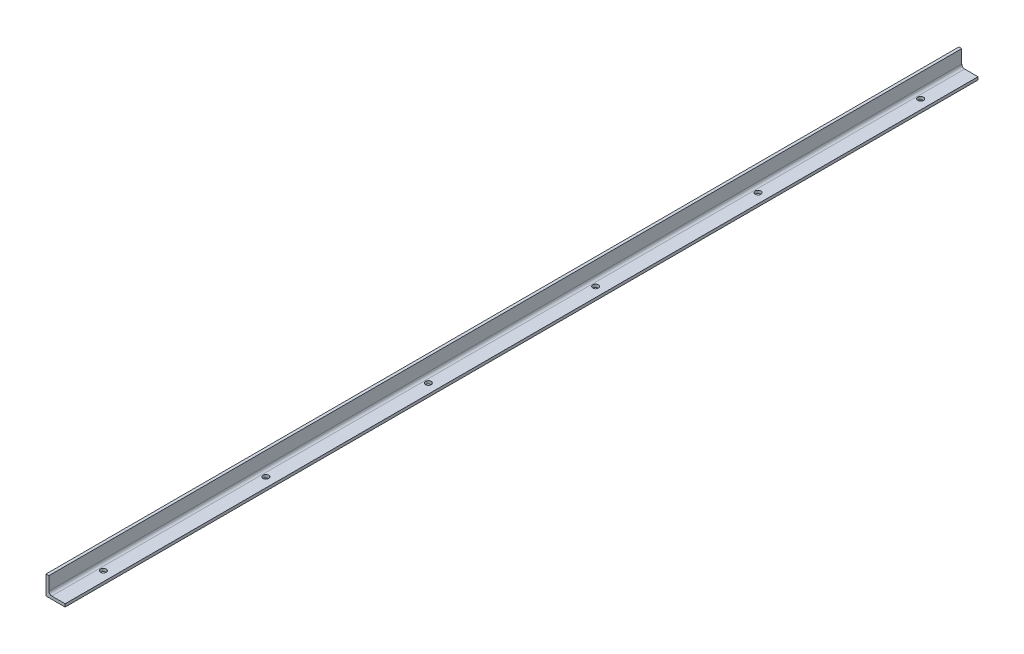
ISO-10303-21;
HEADER;
FILE_DESCRIPTION(('STEP AP214'),'2;1');
FILE_NAME('part.step','',(''),(''),'','','');
FILE_SCHEMA(('AUTOMOTIVE_DESIGN { 1 0 10303 214 1 1 1 1 }'));
ENDSEC;
DATA;
#1=APPLICATION_CONTEXT('core data for automotive mechanical design processes');
#2=APPLICATION_PROTOCOL_DEFINITION('international standard','automotive_design',2000,#1);
#3=PRODUCT_CONTEXT('',#1,'mechanical');
#4=PRODUCT('Part','Part','',(#3));
#5=PRODUCT_RELATED_PRODUCT_CATEGORY('part','',(#4));
#6=PRODUCT_DEFINITION_FORMATION('','',#4);
#7=PRODUCT_DEFINITION_CONTEXT('part definition',#1,'design');
#8=PRODUCT_DEFINITION('design','',#6,#7);
#9=PRODUCT_DEFINITION_SHAPE('','',#8);
#10=(LENGTH_UNIT() NAMED_UNIT(*) SI_UNIT(.MILLI.,.METRE.));
#11=(NAMED_UNIT(*) PLANE_ANGLE_UNIT() SI_UNIT($,.RADIAN.));
#12=(NAMED_UNIT(*) SI_UNIT($,.STERADIAN.) SOLID_ANGLE_UNIT());
#13=UNCERTAINTY_MEASURE_WITH_UNIT(LENGTH_MEASURE(1.E-05),#10,'distance_accuracy_value','');
#14=(GEOMETRIC_REPRESENTATION_CONTEXT(3) GLOBAL_UNCERTAINTY_ASSIGNED_CONTEXT((#13)) GLOBAL_UNIT_ASSIGNED_CONTEXT((#10,
#11,#12)) REPRESENTATION_CONTEXT('',''));
#15=CARTESIAN_POINT('',(0.,0.,0.));
#16=DIRECTION('',(0.,0.,1.));
#17=DIRECTION('',(1.,0.,0.));
#18=AXIS2_PLACEMENT_3D('',#15,#16,#17);
#19=CARTESIAN_POINT('',(20.,0.,955.));
#20=DIRECTION('',(0.,1.,0.));
#21=DIRECTION('',(-1.,0.,0.));
#22=AXIS2_PLACEMENT_3D('',#19,#20,#21);
#23=PLANE('',#22);
#24=CARTESIAN_POINT('',(10.,0.,565.));
#25=DIRECTION('',(0.,-1.,0.));
#26=DIRECTION('',(1.,0.,0.));
#27=AXIS2_PLACEMENT_3D('',#24,#25,#26);
#28=CIRCLE('',#27,3.);
#29=CARTESIAN_POINT('',(13.,0.,565.));
#30=VERTEX_POINT('',#29);
#31=EDGE_CURVE('E210',#30,#30,#28,.T.);
#32=ORIENTED_EDGE('',*,*,#31,.F.);
#33=EDGE_LOOP('',(#32));
#34=FACE_BOUND('',#33,.T.);
#35=CARTESIAN_POINT('',(10.,0.,390.));
#36=DIRECTION('',(0.,-1.,0.));
#37=DIRECTION('',(1.,0.,0.));
#38=AXIS2_PLACEMENT_3D('',#35,#36,#37);
#39=CIRCLE('',#38,3.);
#40=CARTESIAN_POINT('',(13.,0.,390.));
#41=VERTEX_POINT('',#40);
#42=EDGE_CURVE('E214',#41,#41,#39,.T.);
#43=ORIENTED_EDGE('',*,*,#42,.F.);
#44=EDGE_LOOP('',(#43));
#45=FACE_BOUND('',#44,.T.);
#46=CARTESIAN_POINT('',(10.,0.,735.));
#47=DIRECTION('',(0.,-1.,0.));
#48=DIRECTION('',(1.,0.,0.));
#49=AXIS2_PLACEMENT_3D('',#46,#47,#48);
#50=CIRCLE('',#49,3.);
#51=CARTESIAN_POINT('',(13.,0.,735.));
#52=VERTEX_POINT('',#51);
#53=EDGE_CURVE('E218',#52,#52,#50,.T.);
#54=ORIENTED_EDGE('',*,*,#53,.F.);
#55=EDGE_LOOP('',(#54));
#56=FACE_BOUND('',#55,.T.);
#57=CARTESIAN_POINT('',(10.,0.,220.));
#58=DIRECTION('',(0.,-1.,0.));
#59=DIRECTION('',(1.,0.,0.));
#60=AXIS2_PLACEMENT_3D('',#57,#58,#59);
#61=CIRCLE('',#60,3.);
#62=CARTESIAN_POINT('',(13.,0.,220.));
#63=VERTEX_POINT('',#62);
#64=EDGE_CURVE('E172',#63,#63,#61,.T.);
#65=ORIENTED_EDGE('',*,*,#64,.F.);
#66=EDGE_LOOP('',(#65));
#67=FACE_BOUND('',#66,.T.);
#68=CARTESIAN_POINT('',(10.,0.,905.));
#69=DIRECTION('',(0.,-1.,0.));
#70=DIRECTION('',(1.,0.,0.));
#71=AXIS2_PLACEMENT_3D('',#68,#69,#70);
#72=CIRCLE('',#71,3.);
#73=CARTESIAN_POINT('',(13.,0.,905.));
#74=VERTEX_POINT('',#73);
#75=EDGE_CURVE('E154',#74,#74,#72,.T.);
#76=ORIENTED_EDGE('',*,*,#75,.F.);
#77=EDGE_LOOP('',(#76));
#78=FACE_BOUND('',#77,.T.);
#79=CARTESIAN_POINT('',(10.,0.,50.));
#80=DIRECTION('',(0.,-1.,0.));
#81=DIRECTION('',(1.,0.,0.));
#82=AXIS2_PLACEMENT_3D('',#79,#80,#81);
#83=CIRCLE('',#82,3.);
#84=CARTESIAN_POINT('',(13.,0.,50.));
#85=VERTEX_POINT('',#84);
#86=EDGE_CURVE('E149',#85,#85,#83,.T.);
#87=ORIENTED_EDGE('',*,*,#86,.F.);
#88=EDGE_LOOP('',(#87));
#89=FACE_BOUND('',#88,.T.);
#90=DIRECTION('',(1.,0.,0.));
#91=VECTOR('',#90,1.);
#92=CARTESIAN_POINT('',(20.,0.,0.));
#93=LINE('',#92,#91);
#94=CARTESIAN_POINT('',(0.,0.,0.));
#95=VERTEX_POINT('',#94);
#96=CARTESIAN_POINT('',(20.,0.,0.));
#97=VERTEX_POINT('',#96);
#98=EDGE_CURVE('E125',#95,#97,#93,.T.);
#99=ORIENTED_EDGE('',*,*,#98,.T.);
#100=DIRECTION('',(0.,0.,-1.));
#101=VECTOR('',#100,1.);
#102=CARTESIAN_POINT('',(20.,0.,955.));
#103=LINE('',#102,#101);
#104=CARTESIAN_POINT('',(20.,0.,955.));
#105=VERTEX_POINT('',#104);
#106=EDGE_CURVE('E11',#105,#97,#103,.T.);
#107=ORIENTED_EDGE('',*,*,#106,.F.);
#108=DIRECTION('',(1.,0.,0.));
#109=VECTOR('',#108,1.);
#110=CARTESIAN_POINT('',(20.,0.,955.));
#111=LINE('',#110,#109);
#112=CARTESIAN_POINT('',(0.,0.,955.));
#113=VERTEX_POINT('',#112);
#114=EDGE_CURVE('E138',#113,#105,#111,.T.);
#115=ORIENTED_EDGE('',*,*,#114,.F.);
#116=DIRECTION('',(0.,0.,-1.));
#117=VECTOR('',#116,1.);
#118=CARTESIAN_POINT('',(0.,0.,955.));
#119=LINE('',#118,#117);
#120=EDGE_CURVE('E121',#113,#95,#119,.T.);
#121=ORIENTED_EDGE('',*,*,#120,.T.);
#122=EDGE_LOOP('',(#99,#107,#115,#121));
#123=FACE_BOUND('',#122,.T.);
#124=ADVANCED_FACE('F33',(#34,#45,#56,#67,#78,#89,#123),#23,.F.);
#125=CARTESIAN_POINT('',(20.,3.,955.));
#126=DIRECTION('',(-1.,0.,0.));
#127=DIRECTION('',(0.,0.,1.));
#128=AXIS2_PLACEMENT_3D('',#125,#126,#127);
#129=PLANE('',#128);
#130=DIRECTION('',(0.,1.,0.));
#131=VECTOR('',#130,1.);
#132=CARTESIAN_POINT('',(20.,3.,0.));
#133=LINE('',#132,#131);
#134=CARTESIAN_POINT('',(20.,3.,0.));
#135=VERTEX_POINT('',#134);
#136=EDGE_CURVE('E128',#97,#135,#133,.T.);
#137=ORIENTED_EDGE('',*,*,#136,.T.);
#138=DIRECTION('',(0.,0.,-1.));
#139=VECTOR('',#138,1.);
#140=CARTESIAN_POINT('',(20.,3.,955.));
#141=LINE('',#140,#139);
#142=CARTESIAN_POINT('',(20.,3.,955.));
#143=VERTEX_POINT('',#142);
#144=EDGE_CURVE('E42',#143,#135,#141,.T.);
#145=ORIENTED_EDGE('',*,*,#144,.F.);
#146=DIRECTION('',(0.,1.,0.));
#147=VECTOR('',#146,1.);
#148=CARTESIAN_POINT('',(20.,3.,955.));
#149=LINE('',#148,#147);
#150=EDGE_CURVE('E91',#105,#143,#149,.T.);
#151=ORIENTED_EDGE('',*,*,#150,.F.);
#152=ORIENTED_EDGE('',*,*,#106,.T.);
#153=EDGE_LOOP('',(#137,#145,#151,#152));
#154=FACE_BOUND('',#153,.T.);
#155=ADVANCED_FACE('F202',(#154),#129,.F.);
#156=CARTESIAN_POINT('',(6.00000000000002,3.,955.));
#157=DIRECTION('',(0.,-1.,0.));
#158=DIRECTION('',(1.,0.,0.));
#159=AXIS2_PLACEMENT_3D('',#156,#157,#158);
#160=PLANE('',#159);
#161=CARTESIAN_POINT('',(10.,3.,565.));
#162=DIRECTION('',(0.,-1.,0.));
#163=DIRECTION('',(1.,0.,0.));
#164=AXIS2_PLACEMENT_3D('',#161,#162,#163);
#165=CIRCLE('',#164,3.);
#166=CARTESIAN_POINT('',(13.,3.,565.));
#167=VERTEX_POINT('',#166);
#168=EDGE_CURVE('E36',#167,#167,#165,.T.);
#169=ORIENTED_EDGE('',*,*,#168,.T.);
#170=EDGE_LOOP('',(#169));
#171=FACE_BOUND('',#170,.T.);
#172=CARTESIAN_POINT('',(10.,3.,390.));
#173=DIRECTION('',(0.,-1.,0.));
#174=DIRECTION('',(1.,0.,0.));
#175=AXIS2_PLACEMENT_3D('',#172,#173,#174);
#176=CIRCLE('',#175,3.);
#177=CARTESIAN_POINT('',(13.,3.,390.));
#178=VERTEX_POINT('',#177);
#179=EDGE_CURVE('E159',#178,#178,#176,.T.);
#180=ORIENTED_EDGE('',*,*,#179,.T.);
#181=EDGE_LOOP('',(#180));
#182=FACE_BOUND('',#181,.T.);
#183=CARTESIAN_POINT('',(10.,3.,735.));
#184=DIRECTION('',(0.,-1.,0.));
#185=DIRECTION('',(1.,0.,0.));
#186=AXIS2_PLACEMENT_3D('',#183,#184,#185);
#187=CIRCLE('',#186,3.);
#188=CARTESIAN_POINT('',(13.,3.,735.));
#189=VERTEX_POINT('',#188);
#190=EDGE_CURVE('E157',#189,#189,#187,.T.);
#191=ORIENTED_EDGE('',*,*,#190,.T.);
#192=EDGE_LOOP('',(#191));
#193=FACE_BOUND('',#192,.T.);
#194=CARTESIAN_POINT('',(10.,3.,220.));
#195=DIRECTION('',(0.,-1.,0.));
#196=DIRECTION('',(1.,0.,0.));
#197=AXIS2_PLACEMENT_3D('',#194,#195,#196);
#198=CIRCLE('',#197,3.);
#199=CARTESIAN_POINT('',(13.,3.,220.));
#200=VERTEX_POINT('',#199);
#201=EDGE_CURVE('E153',#200,#200,#198,.T.);
#202=ORIENTED_EDGE('',*,*,#201,.T.);
#203=EDGE_LOOP('',(#202));
#204=FACE_BOUND('',#203,.T.);
#205=CARTESIAN_POINT('',(10.,3.,905.));
#206=DIRECTION('',(0.,-1.,0.));
#207=DIRECTION('',(1.,0.,0.));
#208=AXIS2_PLACEMENT_3D('',#205,#206,#207);
#209=CIRCLE('',#208,3.);
#210=CARTESIAN_POINT('',(13.,3.,905.));
#211=VERTEX_POINT('',#210);
#212=EDGE_CURVE('E150',#211,#211,#209,.T.);
#213=ORIENTED_EDGE('',*,*,#212,.T.);
#214=EDGE_LOOP('',(#213));
#215=FACE_BOUND('',#214,.T.);
#216=CARTESIAN_POINT('',(10.,3.,50.));
#217=DIRECTION('',(0.,-1.,0.));
#218=DIRECTION('',(1.,0.,0.));
#219=AXIS2_PLACEMENT_3D('',#216,#217,#218);
#220=CIRCLE('',#219,3.);
#221=CARTESIAN_POINT('',(13.,3.,50.));
#222=VERTEX_POINT('',#221);
#223=EDGE_CURVE('E129',#222,#222,#220,.T.);
#224=ORIENTED_EDGE('',*,*,#223,.T.);
#225=EDGE_LOOP('',(#224));
#226=FACE_BOUND('',#225,.T.);
#227=DIRECTION('',(-1.,0.,0.));
#228=VECTOR('',#227,1.);
#229=CARTESIAN_POINT('',(6.00000000000002,3.,0.));
#230=LINE('',#229,#228);
#231=CARTESIAN_POINT('',(6.00000000000002,3.,0.));
#232=VERTEX_POINT('',#231);
#233=EDGE_CURVE('E131',#135,#232,#230,.T.);
#234=ORIENTED_EDGE('',*,*,#233,.T.);
#235=DIRECTION('',(0.,0.,-1.));
#236=VECTOR('',#235,1.);
#237=CARTESIAN_POINT('',(6.00000000000002,3.,955.));
#238=LINE('',#237,#236);
#239=CARTESIAN_POINT('',(6.00000000000002,3.,955.));
#240=VERTEX_POINT('',#239);
#241=EDGE_CURVE('E142',#240,#232,#238,.T.);
#242=ORIENTED_EDGE('',*,*,#241,.F.);
#243=DIRECTION('',(-1.,0.,0.));
#244=VECTOR('',#243,1.);
#245=CARTESIAN_POINT('',(6.00000000000002,3.,955.));
#246=LINE('',#245,#244);
#247=EDGE_CURVE('E176',#143,#240,#246,.T.);
#248=ORIENTED_EDGE('',*,*,#247,.F.);
#249=ORIENTED_EDGE('',*,*,#144,.T.);
#250=EDGE_LOOP('',(#234,#242,#248,#249));
#251=FACE_BOUND('',#250,.T.);
#252=ADVANCED_FACE('F180',(#171,#182,#193,#204,#215,#226,#251),#160,.F.);
#253=CARTESIAN_POINT('',(6.,6.,955.));
#254=DIRECTION('',(0.,0.,-1.));
#255=DIRECTION('',(-1.,0.,0.));
#256=AXIS2_PLACEMENT_3D('',#253,#254,#255);
#257=CYLINDRICAL_SURFACE('',#256,3.);
#258=CARTESIAN_POINT('',(6.,6.,0.));
#259=DIRECTION('',(0.,0.,-1.));
#260=DIRECTION('',(1.,0.,0.));
#261=AXIS2_PLACEMENT_3D('',#258,#259,#260);
#262=CIRCLE('',#261,3.);
#263=CARTESIAN_POINT('',(3.,6.00000000000002,0.));
#264=VERTEX_POINT('',#263);
#265=EDGE_CURVE('E133',#232,#264,#262,.T.);
#266=ORIENTED_EDGE('',*,*,#265,.T.);
#267=DIRECTION('',(0.,0.,-1.));
#268=VECTOR('',#267,1.);
#269=CARTESIAN_POINT('',(3.,6.00000000000002,955.));
#270=LINE('',#269,#268);
#271=CARTESIAN_POINT('',(3.,6.00000000000002,955.));
#272=VERTEX_POINT('',#271);
#273=EDGE_CURVE('E116',#272,#264,#270,.T.);
#274=ORIENTED_EDGE('',*,*,#273,.F.);
#275=CARTESIAN_POINT('',(6.,6.,955.));
#276=DIRECTION('',(0.,0.,-1.));
#277=DIRECTION('',(1.,0.,0.));
#278=AXIS2_PLACEMENT_3D('',#275,#276,#277);
#279=CIRCLE('',#278,3.);
#280=EDGE_CURVE('E107',#240,#272,#279,.T.);
#281=ORIENTED_EDGE('',*,*,#280,.F.);
#282=ORIENTED_EDGE('',*,*,#241,.T.);
#283=EDGE_LOOP('',(#266,#274,#281,#282));
#284=FACE_BOUND('',#283,.T.);
#285=ADVANCED_FACE('F184',(#284),#257,.F.);
#286=CARTESIAN_POINT('',(3.,20.,955.));
#287=DIRECTION('',(-1.,0.,0.));
#288=DIRECTION('',(0.,-1.,0.));
#289=AXIS2_PLACEMENT_3D('',#286,#287,#288);
#290=PLANE('',#289);
#291=DIRECTION('',(0.,1.,0.));
#292=VECTOR('',#291,1.);
#293=CARTESIAN_POINT('',(3.,20.,0.));
#294=LINE('',#293,#292);
#295=CARTESIAN_POINT('',(3.,20.,0.));
#296=VERTEX_POINT('',#295);
#297=EDGE_CURVE('E115',#264,#296,#294,.T.);
#298=ORIENTED_EDGE('',*,*,#297,.T.);
#299=DIRECTION('',(0.,0.,-1.));
#300=VECTOR('',#299,1.);
#301=CARTESIAN_POINT('',(3.,20.,955.));
#302=LINE('',#301,#300);
#303=CARTESIAN_POINT('',(3.,20.,955.));
#304=VERTEX_POINT('',#303);
#305=EDGE_CURVE('E112',#304,#296,#302,.T.);
#306=ORIENTED_EDGE('',*,*,#305,.F.);
#307=DIRECTION('',(0.,1.,0.));
#308=VECTOR('',#307,1.);
#309=CARTESIAN_POINT('',(3.,20.,955.));
#310=LINE('',#309,#308);
#311=EDGE_CURVE('E101',#272,#304,#310,.T.);
#312=ORIENTED_EDGE('',*,*,#311,.F.);
#313=ORIENTED_EDGE('',*,*,#273,.T.);
#314=EDGE_LOOP('',(#298,#306,#312,#313));
#315=FACE_BOUND('',#314,.T.);
#316=ADVANCED_FACE('F113',(#315),#290,.F.);
#317=CARTESIAN_POINT('',(0.,20.,955.));
#318=DIRECTION('',(0.,-1.,0.));
#319=DIRECTION('',(0.,0.,-1.));
#320=AXIS2_PLACEMENT_3D('',#317,#318,#319);
#321=PLANE('',#320);
#322=DIRECTION('',(-1.,0.,0.));
#323=VECTOR('',#322,1.);
#324=CARTESIAN_POINT('',(0.,20.,0.));
#325=LINE('',#324,#323);
#326=CARTESIAN_POINT('',(0.,20.,0.));
#327=VERTEX_POINT('',#326);
#328=EDGE_CURVE('E77',#296,#327,#325,.T.);
#329=ORIENTED_EDGE('',*,*,#328,.T.);
#330=DIRECTION('',(0.,0.,-1.));
#331=VECTOR('',#330,1.);
#332=CARTESIAN_POINT('',(0.,20.,955.));
#333=LINE('',#332,#331);
#334=CARTESIAN_POINT('',(0.,20.,955.));
#335=VERTEX_POINT('',#334);
#336=EDGE_CURVE('E117',#335,#327,#333,.T.);
#337=ORIENTED_EDGE('',*,*,#336,.F.);
#338=DIRECTION('',(-1.,0.,0.));
#339=VECTOR('',#338,1.);
#340=CARTESIAN_POINT('',(0.,20.,955.));
#341=LINE('',#340,#339);
#342=EDGE_CURVE('E105',#304,#335,#341,.T.);
#343=ORIENTED_EDGE('',*,*,#342,.F.);
#344=ORIENTED_EDGE('',*,*,#305,.T.);
#345=EDGE_LOOP('',(#329,#337,#343,#344));
#346=FACE_BOUND('',#345,.T.);
#347=ADVANCED_FACE('F119',(#346),#321,.F.);
#348=CARTESIAN_POINT('',(0.,0.,955.));
#349=DIRECTION('',(1.,0.,0.));
#350=DIRECTION('',(0.,0.,-1.));
#351=AXIS2_PLACEMENT_3D('',#348,#349,#350);
#352=PLANE('',#351);
#353=DIRECTION('',(0.,-1.,0.));
#354=VECTOR('',#353,1.);
#355=CARTESIAN_POINT('',(0.,0.,0.));
#356=LINE('',#355,#354);
#357=EDGE_CURVE('E83',#327,#95,#356,.T.);
#358=ORIENTED_EDGE('',*,*,#357,.T.);
#359=ORIENTED_EDGE('',*,*,#120,.F.);
#360=DIRECTION('',(0.,-1.,0.));
#361=VECTOR('',#360,1.);
#362=CARTESIAN_POINT('',(0.,0.,955.));
#363=LINE('',#362,#361);
#364=EDGE_CURVE('E51',#335,#113,#363,.T.);
#365=ORIENTED_EDGE('',*,*,#364,.F.);
#366=ORIENTED_EDGE('',*,*,#336,.T.);
#367=EDGE_LOOP('',(#358,#359,#365,#366));
#368=FACE_BOUND('',#367,.T.);
#369=ADVANCED_FACE('F191',(#368),#352,.F.);
#370=CARTESIAN_POINT('',(6.,6.,955.));
#371=DIRECTION('',(0.,0.,1.));
#372=DIRECTION('',(1.,0.,0.));
#373=AXIS2_PLACEMENT_3D('',#370,#371,#372);
#374=PLANE('',#373);
#375=ORIENTED_EDGE('',*,*,#114,.T.);
#376=ORIENTED_EDGE('',*,*,#150,.T.);
#377=ORIENTED_EDGE('',*,*,#247,.T.);
#378=ORIENTED_EDGE('',*,*,#280,.T.);
#379=ORIENTED_EDGE('',*,*,#311,.T.);
#380=ORIENTED_EDGE('',*,*,#342,.T.);
#381=ORIENTED_EDGE('',*,*,#364,.T.);
#382=EDGE_LOOP('',(#375,#376,#377,#378,#379,#380,#381));
#383=FACE_BOUND('',#382,.T.);
#384=ADVANCED_FACE('F103',(#383),#374,.T.);
#385=CARTESIAN_POINT('',(6.,6.,0.));
#386=DIRECTION('',(0.,0.,1.));
#387=DIRECTION('',(1.,0.,0.));
#388=AXIS2_PLACEMENT_3D('',#385,#386,#387);
#389=PLANE('',#388);
#390=ORIENTED_EDGE('',*,*,#98,.F.);
#391=ORIENTED_EDGE('',*,*,#357,.F.);
#392=ORIENTED_EDGE('',*,*,#328,.F.);
#393=ORIENTED_EDGE('',*,*,#297,.F.);
#394=ORIENTED_EDGE('',*,*,#265,.F.);
#395=ORIENTED_EDGE('',*,*,#233,.F.);
#396=ORIENTED_EDGE('',*,*,#136,.F.);
#397=EDGE_LOOP('',(#390,#391,#392,#393,#394,#395,#396));
#398=FACE_BOUND('',#397,.T.);
#399=ADVANCED_FACE('F187',(#398),#389,.F.);
#400=CARTESIAN_POINT('',(9.99999999999999,955.,50.));
#401=DIRECTION('',(0.,-1.,0.));
#402=DIRECTION('',(1.,0.,0.));
#403=AXIS2_PLACEMENT_3D('',#400,#401,#402);
#404=CYLINDRICAL_SURFACE('',#403,3.);
#405=ORIENTED_EDGE('',*,*,#86,.T.);
#406=EDGE_LOOP('',(#405));
#407=FACE_BOUND('',#406,.T.);
#408=ORIENTED_EDGE('',*,*,#223,.F.);
#409=EDGE_LOOP('',(#408));
#410=FACE_BOUND('',#409,.T.);
#411=ADVANCED_FACE('F247',(#407,#410),#404,.F.);
#412=CARTESIAN_POINT('',(9.99999999999999,955.,905.));
#413=DIRECTION('',(0.,-1.,0.));
#414=DIRECTION('',(1.,0.,0.));
#415=AXIS2_PLACEMENT_3D('',#412,#413,#414);
#416=CYLINDRICAL_SURFACE('',#415,3.);
#417=ORIENTED_EDGE('',*,*,#75,.T.);
#418=EDGE_LOOP('',(#417));
#419=FACE_BOUND('',#418,.T.);
#420=ORIENTED_EDGE('',*,*,#212,.F.);
#421=EDGE_LOOP('',(#420));
#422=FACE_BOUND('',#421,.T.);
#423=ADVANCED_FACE('F249',(#419,#422),#416,.F.);
#424=CARTESIAN_POINT('',(9.99999999999999,955.,220.));
#425=DIRECTION('',(0.,-1.,0.));
#426=DIRECTION('',(1.,0.,0.));
#427=AXIS2_PLACEMENT_3D('',#424,#425,#426);
#428=CYLINDRICAL_SURFACE('',#427,3.);
#429=ORIENTED_EDGE('',*,*,#64,.T.);
#430=EDGE_LOOP('',(#429));
#431=FACE_BOUND('',#430,.T.);
#432=ORIENTED_EDGE('',*,*,#201,.F.);
#433=EDGE_LOOP('',(#432));
#434=FACE_BOUND('',#433,.T.);
#435=ADVANCED_FACE('F234',(#431,#434),#428,.F.);
#436=CARTESIAN_POINT('',(9.99999999999999,955.,735.));
#437=DIRECTION('',(0.,-1.,0.));
#438=DIRECTION('',(1.,0.,0.));
#439=AXIS2_PLACEMENT_3D('',#436,#437,#438);
#440=CYLINDRICAL_SURFACE('',#439,3.);
#441=ORIENTED_EDGE('',*,*,#53,.T.);
#442=EDGE_LOOP('',(#441));
#443=FACE_BOUND('',#442,.T.);
#444=ORIENTED_EDGE('',*,*,#190,.F.);
#445=EDGE_LOOP('',(#444));
#446=FACE_BOUND('',#445,.T.);
#447=ADVANCED_FACE('F230',(#443,#446),#440,.F.);
#448=CARTESIAN_POINT('',(9.99999999999999,955.,390.));
#449=DIRECTION('',(0.,-1.,0.));
#450=DIRECTION('',(1.,0.,0.));
#451=AXIS2_PLACEMENT_3D('',#448,#449,#450);
#452=CYLINDRICAL_SURFACE('',#451,3.);
#453=ORIENTED_EDGE('',*,*,#42,.T.);
#454=EDGE_LOOP('',(#453));
#455=FACE_BOUND('',#454,.T.);
#456=ORIENTED_EDGE('',*,*,#179,.F.);
#457=EDGE_LOOP('',(#456));
#458=FACE_BOUND('',#457,.T.);
#459=ADVANCED_FACE('F233',(#455,#458),#452,.F.);
#460=CARTESIAN_POINT('',(9.99999999999999,955.,565.));
#461=DIRECTION('',(0.,-1.,0.));
#462=DIRECTION('',(1.,0.,0.));
#463=AXIS2_PLACEMENT_3D('',#460,#461,#462);
#464=CYLINDRICAL_SURFACE('',#463,3.);
#465=ORIENTED_EDGE('',*,*,#31,.T.);
#466=EDGE_LOOP('',(#465));
#467=FACE_BOUND('',#466,.T.);
#468=ORIENTED_EDGE('',*,*,#168,.F.);
#469=EDGE_LOOP('',(#468));
#470=FACE_BOUND('',#469,.T.);
#471=ADVANCED_FACE('F260',(#467,#470),#464,.F.);
#472=CLOSED_SHELL('',(#124,#155,#252,#285,#316,#347,#369,#384,#399,#411,#423,#435,#447,#459,#471));
#473=MANIFOLD_SOLID_BREP('B2',#472);
#474=ADVANCED_BREP_SHAPE_REPRESENTATION('',(#18,#473),#14);
#475=SHAPE_DEFINITION_REPRESENTATION(#9,#474);
ENDSEC;
END-ISO-10303-21;
